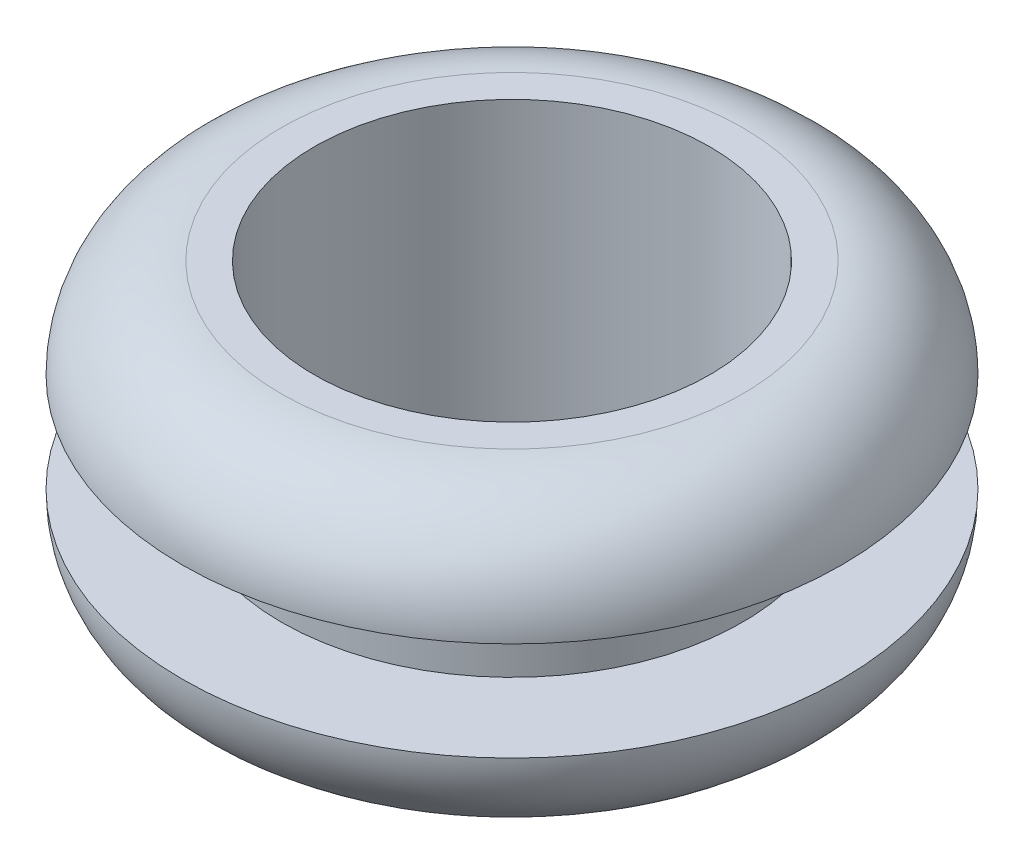
ISO-10303-21;
HEADER;
FILE_DESCRIPTION(('STEP AP214'),'2;1');
FILE_NAME('part.step','',(''),(''),'','','');
FILE_SCHEMA(('AUTOMOTIVE_DESIGN { 1 0 10303 214 1 1 1 1 }'));
ENDSEC;
DATA;
#1=APPLICATION_CONTEXT('core data for automotive mechanical design processes');
#2=APPLICATION_PROTOCOL_DEFINITION('international standard','automotive_design',2000,#1);
#3=PRODUCT_CONTEXT('',#1,'mechanical');
#4=PRODUCT('Part','Part','',(#3));
#5=PRODUCT_RELATED_PRODUCT_CATEGORY('part','',(#4));
#6=PRODUCT_DEFINITION_FORMATION('','',#4);
#7=PRODUCT_DEFINITION_CONTEXT('part definition',#1,'design');
#8=PRODUCT_DEFINITION('design','',#6,#7);
#9=PRODUCT_DEFINITION_SHAPE('','',#8);
#10=(LENGTH_UNIT() NAMED_UNIT(*) SI_UNIT(.MILLI.,.METRE.));
#11=(NAMED_UNIT(*) PLANE_ANGLE_UNIT() SI_UNIT($,.RADIAN.));
#12=(NAMED_UNIT(*) SI_UNIT($,.STERADIAN.) SOLID_ANGLE_UNIT());
#13=UNCERTAINTY_MEASURE_WITH_UNIT(LENGTH_MEASURE(1.E-05),#10,'distance_accuracy_value','');
#14=(GEOMETRIC_REPRESENTATION_CONTEXT(3) GLOBAL_UNCERTAINTY_ASSIGNED_CONTEXT((#13)) GLOBAL_UNIT_ASSIGNED_CONTEXT((#10,
#11,#12)) REPRESENTATION_CONTEXT('',''));
#15=CARTESIAN_POINT('',(0.,0.,0.));
#16=DIRECTION('',(0.,0.,1.));
#17=DIRECTION('',(1.,0.,0.));
#18=AXIS2_PLACEMENT_3D('',#15,#16,#17);
#19=CARTESIAN_POINT('',(0.,-3.571875,4.7625));
#20=DIRECTION('',(0.,1.,0.));
#21=DIRECTION('',(0.,0.,1.));
#22=AXIS2_PLACEMENT_3D('',#19,#20,#21);
#23=PLANE('',#22);
#24=CARTESIAN_POINT('',(0.,-3.571875,0.));
#25=DIRECTION('',(0.,-1.,0.));
#26=DIRECTION('',(0.,0.,-1.));
#27=AXIS2_PLACEMENT_3D('',#24,#25,#26);
#28=CIRCLE('',#27,4.7625);
#29=CARTESIAN_POINT('',(0.,-3.571875,-4.7625));
#30=VERTEX_POINT('',#29);
#31=EDGE_CURVE('E10',#30,#30,#28,.T.);
#32=ORIENTED_EDGE('',*,*,#31,.F.);
#33=EDGE_LOOP('',(#32));
#34=FACE_BOUND('',#33,.T.);
#35=CARTESIAN_POINT('',(0.,-3.571875,0.));
#36=DIRECTION('',(0.,-1.,0.));
#37=DIRECTION('',(0.,0.,-1.));
#38=AXIS2_PLACEMENT_3D('',#35,#36,#37);
#39=CIRCLE('',#38,5.55625);
#40=CARTESIAN_POINT('',(0.,-3.571875,-5.55625));
#41=VERTEX_POINT('',#40);
#42=EDGE_CURVE('E58',#41,#41,#39,.T.);
#43=ORIENTED_EDGE('',*,*,#42,.T.);
#44=EDGE_LOOP('',(#43));
#45=FACE_BOUND('',#44,.T.);
#46=ADVANCED_FACE('F30',(#34,#45),#23,.F.);
#47=CARTESIAN_POINT('',(0.,-3.571875,0.));
#48=DIRECTION('',(0.,-1.,0.));
#49=DIRECTION('',(0.,0.,-1.));
#50=AXIS2_PLACEMENT_3D('',#47,#48,#49);
#51=CYLINDRICAL_SURFACE('',#50,4.7625);
#52=CARTESIAN_POINT('',(0.,3.571875,0.));
#53=DIRECTION('',(0.,-1.,0.));
#54=DIRECTION('',(0.,0.,-1.));
#55=AXIS2_PLACEMENT_3D('',#52,#53,#54);
#56=CIRCLE('',#55,4.7625);
#57=CARTESIAN_POINT('',(0.,3.571875,-4.7625));
#58=VERTEX_POINT('',#57);
#59=EDGE_CURVE('E36',#58,#58,#56,.T.);
#60=ORIENTED_EDGE('',*,*,#59,.F.);
#61=EDGE_LOOP('',(#60));
#62=FACE_BOUND('',#61,.T.);
#63=ORIENTED_EDGE('',*,*,#31,.T.);
#64=EDGE_LOOP('',(#63));
#65=FACE_BOUND('',#64,.T.);
#66=ADVANCED_FACE('F95',(#62,#65),#51,.F.);
#67=CARTESIAN_POINT('',(0.,3.571875,4.7625));
#68=DIRECTION('',(0.,-1.,0.));
#69=DIRECTION('',(0.,0.,-1.));
#70=AXIS2_PLACEMENT_3D('',#67,#68,#69);
#71=PLANE('',#70);
#72=CARTESIAN_POINT('',(0.,3.571875,0.));
#73=DIRECTION('',(0.,-1.,0.));
#74=DIRECTION('',(0.,0.,-1.));
#75=AXIS2_PLACEMENT_3D('',#72,#73,#74);
#76=CIRCLE('',#75,5.55625);
#77=CARTESIAN_POINT('',(0.,3.571875,-5.55625));
#78=VERTEX_POINT('',#77);
#79=EDGE_CURVE('E40',#78,#78,#76,.T.);
#80=ORIENTED_EDGE('',*,*,#79,.F.);
#81=EDGE_LOOP('',(#80));
#82=FACE_BOUND('',#81,.T.);
#83=ORIENTED_EDGE('',*,*,#59,.T.);
#84=EDGE_LOOP('',(#83));
#85=FACE_BOUND('',#84,.T.);
#86=ADVANCED_FACE('F90',(#82,#85),#71,.F.);
#87=CARTESIAN_POINT('',(0.,1.190625,0.));
#88=DIRECTION('',(0.,-1.,0.));
#89=DIRECTION('',(0.,0.,-1.));
#90=AXIS2_PLACEMENT_3D('',#87,#88,#89);
#91=TOROIDAL_SURFACE('',#90,5.55625,2.38125);
#92=CARTESIAN_POINT('',(0.,1.190625,0.));
#93=DIRECTION('',(0.,-1.,0.));
#94=DIRECTION('',(0.,0.,-1.));
#95=AXIS2_PLACEMENT_3D('',#92,#93,#94);
#96=CIRCLE('',#95,7.9375);
#97=CARTESIAN_POINT('',(0.,1.190625,-7.9375));
#98=VERTEX_POINT('',#97);
#99=EDGE_CURVE('E44',#98,#98,#96,.T.);
#100=ORIENTED_EDGE('',*,*,#99,.F.);
#101=EDGE_LOOP('',(#100));
#102=FACE_BOUND('',#101,.T.);
#103=ORIENTED_EDGE('',*,*,#79,.T.);
#104=EDGE_LOOP('',(#103));
#105=FACE_BOUND('',#104,.T.);
#106=ADVANCED_FACE('F84',(#102,#105),#91,.T.);
#107=CARTESIAN_POINT('',(0.,1.190625,5.55625));
#108=DIRECTION('',(0.,1.,0.));
#109=DIRECTION('',(0.,0.,1.));
#110=AXIS2_PLACEMENT_3D('',#107,#108,#109);
#111=PLANE('',#110);
#112=CARTESIAN_POINT('',(0.,1.190625,0.));
#113=DIRECTION('',(0.,-1.,0.));
#114=DIRECTION('',(0.,0.,-1.));
#115=AXIS2_PLACEMENT_3D('',#112,#113,#114);
#116=CIRCLE('',#115,5.55625);
#117=CARTESIAN_POINT('',(0.,1.190625,-5.55625));
#118=VERTEX_POINT('',#117);
#119=EDGE_CURVE('E49',#118,#118,#116,.T.);
#120=ORIENTED_EDGE('',*,*,#119,.F.);
#121=EDGE_LOOP('',(#120));
#122=FACE_BOUND('',#121,.T.);
#123=ORIENTED_EDGE('',*,*,#99,.T.);
#124=EDGE_LOOP('',(#123));
#125=FACE_BOUND('',#124,.T.);
#126=ADVANCED_FACE('F78',(#122,#125),#111,.F.);
#127=CARTESIAN_POINT('',(0.,-3.571875,0.));
#128=DIRECTION('',(0.,-1.,0.));
#129=DIRECTION('',(0.,0.,-1.));
#130=AXIS2_PLACEMENT_3D('',#127,#128,#129);
#131=CYLINDRICAL_SURFACE('',#130,5.55625);
#132=CARTESIAN_POINT('',(0.,-1.190625,0.));
#133=DIRECTION('',(0.,-1.,0.));
#134=DIRECTION('',(0.,0.,-1.));
#135=AXIS2_PLACEMENT_3D('',#132,#133,#134);
#136=CIRCLE('',#135,5.55625);
#137=CARTESIAN_POINT('',(0.,-1.190625,-5.55625));
#138=VERTEX_POINT('',#137);
#139=EDGE_CURVE('E52',#138,#138,#136,.T.);
#140=ORIENTED_EDGE('',*,*,#139,.F.);
#141=EDGE_LOOP('',(#140));
#142=FACE_BOUND('',#141,.T.);
#143=ORIENTED_EDGE('',*,*,#119,.T.);
#144=EDGE_LOOP('',(#143));
#145=FACE_BOUND('',#144,.T.);
#146=ADVANCED_FACE('F72',(#142,#145),#131,.T.);
#147=CARTESIAN_POINT('',(0.,-1.190625,5.55625));
#148=DIRECTION('',(0.,-1.,0.));
#149=DIRECTION('',(0.,0.,-1.));
#150=AXIS2_PLACEMENT_3D('',#147,#148,#149);
#151=PLANE('',#150);
#152=CARTESIAN_POINT('',(0.,-1.190625,0.));
#153=DIRECTION('',(0.,-1.,0.));
#154=DIRECTION('',(0.,0.,-1.));
#155=AXIS2_PLACEMENT_3D('',#152,#153,#154);
#156=CIRCLE('',#155,7.9375);
#157=CARTESIAN_POINT('',(0.,-1.190625,-7.9375));
#158=VERTEX_POINT('',#157);
#159=EDGE_CURVE('E55',#158,#158,#156,.T.);
#160=ORIENTED_EDGE('',*,*,#159,.F.);
#161=EDGE_LOOP('',(#160));
#162=FACE_BOUND('',#161,.T.);
#163=ORIENTED_EDGE('',*,*,#139,.T.);
#164=EDGE_LOOP('',(#163));
#165=FACE_BOUND('',#164,.T.);
#166=ADVANCED_FACE('F66',(#162,#165),#151,.F.);
#167=CARTESIAN_POINT('',(0.,-1.190625,0.));
#168=DIRECTION('',(0.,-1.,0.));
#169=DIRECTION('',(0.,0.,-1.));
#170=AXIS2_PLACEMENT_3D('',#167,#168,#169);
#171=TOROIDAL_SURFACE('',#170,5.55625,2.38125);
#172=ORIENTED_EDGE('',*,*,#42,.F.);
#173=EDGE_LOOP('',(#172));
#174=FACE_BOUND('',#173,.T.);
#175=ORIENTED_EDGE('',*,*,#159,.T.);
#176=EDGE_LOOP('',(#175));
#177=FACE_BOUND('',#176,.T.);
#178=ADVANCED_FACE('F63',(#174,#177),#171,.T.);
#179=CLOSED_SHELL('',(#46,#66,#86,#106,#126,#146,#166,#178));
#180=MANIFOLD_SOLID_BREP('B2',#179);
#181=ADVANCED_BREP_SHAPE_REPRESENTATION('',(#18,#180),#14);
#182=SHAPE_DEFINITION_REPRESENTATION(#9,#181);
ENDSEC;
END-ISO-10303-21;
